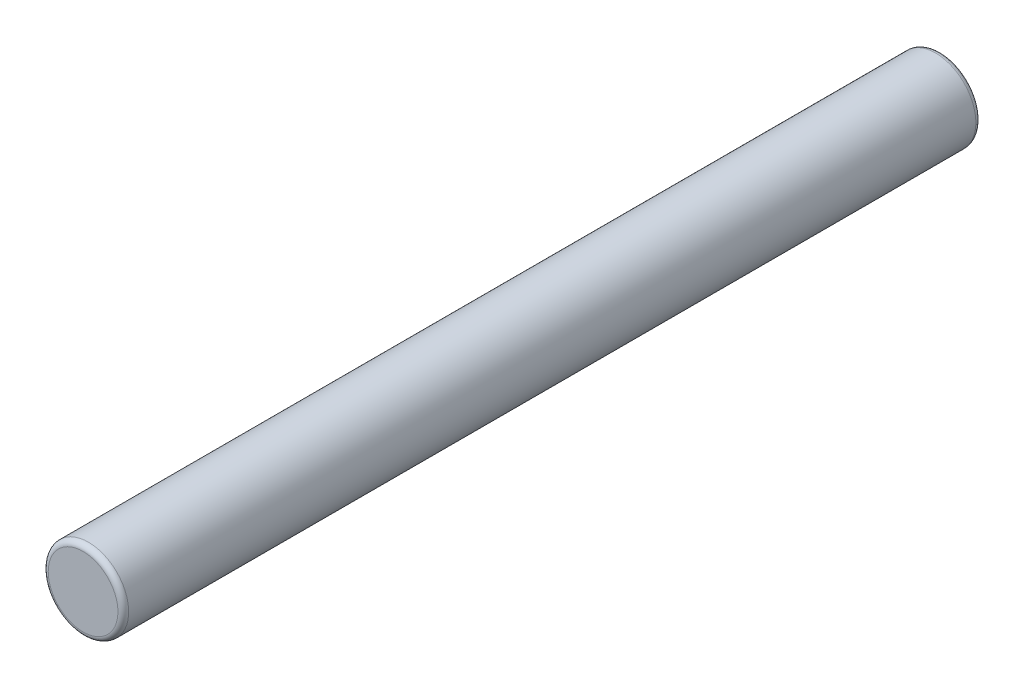
ISO-10303-21;
HEADER;
FILE_DESCRIPTION(('STEP AP214'),'2;1');
FILE_NAME('part.step','',(''),(''),'','','');
FILE_SCHEMA(('AUTOMOTIVE_DESIGN { 1 0 10303 214 1 1 1 1 }'));
ENDSEC;
DATA;
#1=APPLICATION_CONTEXT('core data for automotive mechanical design processes');
#2=APPLICATION_PROTOCOL_DEFINITION('international standard','automotive_design',2000,#1);
#3=PRODUCT_CONTEXT('',#1,'mechanical');
#4=PRODUCT('Part','Part','',(#3));
#5=PRODUCT_RELATED_PRODUCT_CATEGORY('part','',(#4));
#6=PRODUCT_DEFINITION_FORMATION('','',#4);
#7=PRODUCT_DEFINITION_CONTEXT('part definition',#1,'design');
#8=PRODUCT_DEFINITION('design','',#6,#7);
#9=PRODUCT_DEFINITION_SHAPE('','',#8);
#10=(LENGTH_UNIT() NAMED_UNIT(*) SI_UNIT(.MILLI.,.METRE.));
#11=(NAMED_UNIT(*) PLANE_ANGLE_UNIT() SI_UNIT($,.RADIAN.));
#12=(NAMED_UNIT(*) SI_UNIT($,.STERADIAN.) SOLID_ANGLE_UNIT());
#13=UNCERTAINTY_MEASURE_WITH_UNIT(LENGTH_MEASURE(1.E-05),#10,'distance_accuracy_value','');
#14=(GEOMETRIC_REPRESENTATION_CONTEXT(3) GLOBAL_UNCERTAINTY_ASSIGNED_CONTEXT((#13)) GLOBAL_UNIT_ASSIGNED_CONTEXT((#10,
#11,#12)) REPRESENTATION_CONTEXT('',''));
#15=CARTESIAN_POINT('',(0.,0.,0.));
#16=DIRECTION('',(0.,0.,1.));
#17=DIRECTION('',(1.,0.,0.));
#18=AXIS2_PLACEMENT_3D('',#15,#16,#17);
#19=CARTESIAN_POINT('',(0.,0.,-16.));
#20=DIRECTION('',(0.,0.,1.));
#21=DIRECTION('',(1.,0.,0.));
#22=AXIS2_PLACEMENT_3D('',#19,#20,#21);
#23=PLANE('',#22);
#24=CARTESIAN_POINT('',(0.,0.,-16.));
#25=DIRECTION('',(0.,0.,-1.));
#26=DIRECTION('',(-1.,0.,0.));
#27=AXIS2_PLACEMENT_3D('',#24,#25,#26);
#28=CIRCLE('',#27,1.3);
#29=CARTESIAN_POINT('',(-1.29999999999999,0.,-16.));
#30=VERTEX_POINT('',#29);
#31=EDGE_CURVE('E10',#30,#30,#28,.T.);
#32=ORIENTED_EDGE('',*,*,#31,.T.);
#33=EDGE_LOOP('',(#32));
#34=FACE_BOUND('',#33,.T.);
#35=ADVANCED_FACE('F30',(#34),#23,.F.);
#36=CARTESIAN_POINT('',(0.,0.,-15.8));
#37=DIRECTION('',(0.,0.,-1.));
#38=DIRECTION('',(-1.,0.,0.));
#39=AXIS2_PLACEMENT_3D('',#36,#37,#38);
#40=TOROIDAL_SURFACE('',#39,1.3,0.199999999999999);
#41=ORIENTED_EDGE('',*,*,#31,.F.);
#42=EDGE_LOOP('',(#41));
#43=FACE_BOUND('',#42,.T.);
#44=CARTESIAN_POINT('',(0.,0.,-15.8));
#45=DIRECTION('',(0.,0.,-1.));
#46=DIRECTION('',(-1.,0.,0.));
#47=AXIS2_PLACEMENT_3D('',#44,#45,#46);
#48=CIRCLE('',#47,1.5);
#49=CARTESIAN_POINT('',(-1.49999999999999,0.,-15.8));
#50=VERTEX_POINT('',#49);
#51=EDGE_CURVE('E36',#50,#50,#48,.T.);
#52=ORIENTED_EDGE('',*,*,#51,.T.);
#53=EDGE_LOOP('',(#52));
#54=FACE_BOUND('',#53,.T.);
#55=ADVANCED_FACE('F62',(#43,#54),#40,.T.);
#56=CARTESIAN_POINT('',(0.,0.,-16.));
#57=DIRECTION('',(0.,0.,-1.));
#58=DIRECTION('',(-1.,0.,0.));
#59=AXIS2_PLACEMENT_3D('',#56,#57,#58);
#60=CYLINDRICAL_SURFACE('',#59,1.5);
#61=ORIENTED_EDGE('',*,*,#51,.F.);
#62=EDGE_LOOP('',(#61));
#63=FACE_BOUND('',#62,.T.);
#64=CARTESIAN_POINT('',(0.,0.,15.8));
#65=DIRECTION('',(0.,0.,-1.));
#66=DIRECTION('',(-1.,0.,0.));
#67=AXIS2_PLACEMENT_3D('',#64,#65,#66);
#68=CIRCLE('',#67,1.5);
#69=CARTESIAN_POINT('',(-1.49999999999999,0.,15.8));
#70=VERTEX_POINT('',#69);
#71=EDGE_CURVE('E40',#70,#70,#68,.T.);
#72=ORIENTED_EDGE('',*,*,#71,.T.);
#73=EDGE_LOOP('',(#72));
#74=FACE_BOUND('',#73,.T.);
#75=ADVANCED_FACE('F58',(#63,#74),#60,.T.);
#76=CARTESIAN_POINT('',(0.,0.,15.8));
#77=DIRECTION('',(0.,0.,-1.));
#78=DIRECTION('',(-1.,0.,0.));
#79=AXIS2_PLACEMENT_3D('',#76,#77,#78);
#80=TOROIDAL_SURFACE('',#79,1.3,0.199999999999999);
#81=ORIENTED_EDGE('',*,*,#71,.F.);
#82=EDGE_LOOP('',(#81));
#83=FACE_BOUND('',#82,.T.);
#84=CARTESIAN_POINT('',(0.,0.,16.));
#85=DIRECTION('',(0.,0.,-1.));
#86=DIRECTION('',(-1.,0.,0.));
#87=AXIS2_PLACEMENT_3D('',#84,#85,#86);
#88=CIRCLE('',#87,1.3);
#89=CARTESIAN_POINT('',(-1.29999999999999,0.,16.));
#90=VERTEX_POINT('',#89);
#91=EDGE_CURVE('E44',#90,#90,#88,.T.);
#92=ORIENTED_EDGE('',*,*,#91,.T.);
#93=EDGE_LOOP('',(#92));
#94=FACE_BOUND('',#93,.T.);
#95=ADVANCED_FACE('F50',(#83,#94),#80,.T.);
#96=CARTESIAN_POINT('',(0.,0.,16.));
#97=DIRECTION('',(0.,0.,-1.));
#98=DIRECTION('',(-1.,0.,0.));
#99=AXIS2_PLACEMENT_3D('',#96,#97,#98);
#100=PLANE('',#99);
#101=ORIENTED_EDGE('',*,*,#91,.F.);
#102=EDGE_LOOP('',(#101));
#103=FACE_BOUND('',#102,.T.);
#104=ADVANCED_FACE('F52',(#103),#100,.F.);
#105=CLOSED_SHELL('',(#35,#55,#75,#95,#104));
#106=MANIFOLD_SOLID_BREP('B2',#105);
#107=ADVANCED_BREP_SHAPE_REPRESENTATION('',(#18,#106),#14);
#108=SHAPE_DEFINITION_REPRESENTATION(#9,#107);
ENDSEC;
END-ISO-10303-21;
